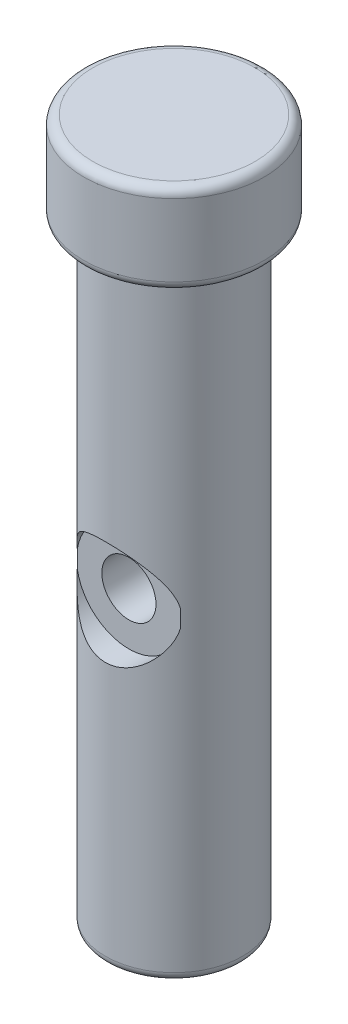
ISO-10303-21;
HEADER;
FILE_DESCRIPTION(('STEP AP214'),'2;1');
FILE_NAME('part.step','',(''),(''),'','','');
FILE_SCHEMA(('AUTOMOTIVE_DESIGN { 1 0 10303 214 1 1 1 1 }'));
ENDSEC;
DATA;
#1=APPLICATION_CONTEXT('core data for automotive mechanical design processes');
#2=APPLICATION_PROTOCOL_DEFINITION('international standard','automotive_design',2000,#1);
#3=PRODUCT_CONTEXT('',#1,'mechanical');
#4=PRODUCT('Part','Part','',(#3));
#5=PRODUCT_RELATED_PRODUCT_CATEGORY('part','',(#4));
#6=PRODUCT_DEFINITION_FORMATION('','',#4);
#7=PRODUCT_DEFINITION_CONTEXT('part definition',#1,'design');
#8=PRODUCT_DEFINITION('design','',#6,#7);
#9=PRODUCT_DEFINITION_SHAPE('','',#8);
#10=(LENGTH_UNIT() NAMED_UNIT(*) SI_UNIT(.MILLI.,.METRE.));
#11=(NAMED_UNIT(*) PLANE_ANGLE_UNIT() SI_UNIT($,.RADIAN.));
#12=(NAMED_UNIT(*) SI_UNIT($,.STERADIAN.) SOLID_ANGLE_UNIT());
#13=UNCERTAINTY_MEASURE_WITH_UNIT(LENGTH_MEASURE(1.E-05),#10,'distance_accuracy_value','');
#14=(GEOMETRIC_REPRESENTATION_CONTEXT(3) GLOBAL_UNCERTAINTY_ASSIGNED_CONTEXT((#13)) GLOBAL_UNIT_ASSIGNED_CONTEXT((#10,
#11,#12)) REPRESENTATION_CONTEXT('',''));
#15=CARTESIAN_POINT('',(0.,0.,0.));
#16=DIRECTION('',(0.,0.,1.));
#17=DIRECTION('',(1.,0.,0.));
#18=AXIS2_PLACEMENT_3D('',#15,#16,#17);
#19=CARTESIAN_POINT('',(0.,0.,0.));
#20=DIRECTION('',(0.,1.,0.));
#21=DIRECTION('',(-1.,0.,0.));
#22=AXIS2_PLACEMENT_3D('',#19,#20,#21);
#23=CYLINDRICAL_SURFACE('',#22,3.79999999999994);
#24=CARTESIAN_POINT('',(0.,-5.,0.));
#25=DIRECTION('',(0.,1.,0.));
#26=DIRECTION('',(-1.,0.,0.));
#27=AXIS2_PLACEMENT_3D('',#24,#25,#26);
#28=CIRCLE('',#27,3.79999999999988);
#29=CARTESIAN_POINT('',(-3.79999999999988,-5.,0.));
#30=VERTEX_POINT('',#29);
#31=EDGE_CURVE('E121',#30,#30,#28,.T.);
#32=ORIENTED_EDGE('',*,*,#31,.F.);
#33=EDGE_LOOP('',(#32));
#34=FACE_BOUND('',#33,.T.);
#35=CARTESIAN_POINT('',(0.,-38.5,0.));
#36=DIRECTION('',(0.,-1.,0.));
#37=DIRECTION('',(1.,0.,0.));
#38=AXIS2_PLACEMENT_3D('',#35,#36,#37);
#39=CIRCLE('',#38,3.79999999999994);
#40=CARTESIAN_POINT('',(3.79999999999994,-38.5,0.));
#41=VERTEX_POINT('',#40);
#42=EDGE_CURVE('E134',#41,#41,#39,.F.);
#43=ORIENTED_EDGE('',*,*,#42,.T.);
#44=EDGE_LOOP('',(#43));
#45=FACE_BOUND('',#44,.T.);
#46=CARTESIAN_POINT('',(1.50000000000001,-21.5,-3.49141805001915));
#47=CARTESIAN_POINT('',(1.49999138934054,-21.5804515862932,-3.49142589940348));
#48=CARTESIAN_POINT('',(1.49348902631829,-21.6610223855993,-3.49423798732025));
#49=CARTESIAN_POINT('',(1.46771910914597,-21.8198585973117,-3.50513672119896));
#50=CARTESIAN_POINT('',(1.44841842111774,-21.8981174735489,-3.51323705718366));
#51=CARTESIAN_POINT('',(1.39789821854028,-22.0497652683184,-3.53364038169468));
#52=CARTESIAN_POINT('',(1.3667228726034,-22.1231710648414,-3.54592777852199));
#53=CARTESIAN_POINT('',(1.29346693178774,-22.263692375484,-3.57329902032761));
#54=CARTESIAN_POINT('',(1.25138892977227,-22.3308093800401,-3.58838220017201));
#55=CARTESIAN_POINT('',(1.15501524548735,-22.4606243065997,-3.62058614923694));
#56=CARTESIAN_POINT('',(1.10021008970153,-22.5229281947145,-3.63777133728669));
#57=CARTESIAN_POINT('',(0.981010864129778,-22.637747473458,-3.67171013127485));
#58=CARTESIAN_POINT('',(0.916613502348842,-22.6902594895799,-3.68846358672032));
#59=CARTESIAN_POINT('',(0.777030595417696,-22.7859431300406,-3.7204213666067));
#60=CARTESIAN_POINT('',(0.701526693832917,-22.828680825116,-3.7355419612661));
#61=CARTESIAN_POINT('',(0.543697838652514,-22.9006809812271,-3.76175194224113));
#62=CARTESIAN_POINT('',(0.461375607469394,-22.9299487901852,-3.77284292805556));
#63=CARTESIAN_POINT('',(0.296376280159388,-22.9727790863564,-3.78928826916624));
#64=CARTESIAN_POINT('',(0.213900018108004,-22.9870187485434,-3.79488907863148));
#65=CARTESIAN_POINT('',(0.047551185709388,-23.0015667483585,-3.80061243706081));
#66=CARTESIAN_POINT('',(-0.0363208669212161,-23.0018801410749,-3.80073697385372));
#67=CARTESIAN_POINT('',(-0.198194350424872,-22.9889429683737,-3.79564520511569));
#68=CARTESIAN_POINT('',(-0.276265864583525,-22.9764337696606,-3.79072081116538));
#69=CARTESIAN_POINT('',(-0.429097336424106,-22.9394645061627,-3.77647568130674));
#70=CARTESIAN_POINT('',(-0.503857051218962,-22.9150035664155,-3.76715462352947));
#71=CARTESIAN_POINT('',(-0.649280023654346,-22.8545228071967,-3.74485417838105));
#72=CARTESIAN_POINT('',(-0.719865108365268,-22.8183352702658,-3.73182206387545));
#73=CARTESIAN_POINT('',(-0.854141836884575,-22.7355837064482,-3.70339831896516));
#74=CARTESIAN_POINT('',(-0.917831134297479,-22.6890161639913,-3.68800588970565));
#75=CARTESIAN_POINT('',(-1.04084398796143,-22.5833431908065,-3.65526365722049));
#76=CARTESIAN_POINT('',(-1.09962553547504,-22.523625168457,-3.63785163152035));
#77=CARTESIAN_POINT('',(-1.20655795312982,-22.3951029827792,-3.60379995652826));
#78=CARTESIAN_POINT('',(-1.25470552607257,-22.3262960118459,-3.58716054805552));
#79=CARTESIAN_POINT('',(-1.3401979249377,-22.1791876117322,-3.55612146395844));
#80=CARTESIAN_POINT('',(-1.37721749372035,-22.1006806475295,-3.5417940362025));
#81=CARTESIAN_POINT('',(-1.43729731683198,-21.9378309772364,-3.51784521745968));
#82=CARTESIAN_POINT('',(-1.46036635639556,-21.8534919811943,-3.50822086548286));
#83=CARTESIAN_POINT('',(-1.49059023775758,-21.6867694576774,-3.49548215031399));
#84=CARTESIAN_POINT('',(-1.49861511123585,-21.6045711238593,-3.49201255715577));
#85=CARTESIAN_POINT('',(-1.50105455936887,-21.4399470740869,-3.49096545123117));
#86=CARTESIAN_POINT('',(-1.49547309517293,-21.3575214312864,-3.49338622362991));
#87=CARTESIAN_POINT('',(-1.47164981281659,-21.199532556138,-3.50348331162731));
#88=CARTESIAN_POINT('',(-1.45411920701902,-21.1238408999755,-3.51086407773853));
#89=CARTESIAN_POINT('',(-1.40781189999666,-20.9765200946043,-3.52968635129391));
#90=CARTESIAN_POINT('',(-1.37903274594538,-20.9048918353521,-3.5411287443549));
#91=CARTESIAN_POINT('',(-1.30975971872506,-20.7645426439679,-3.56734484173044));
#92=CARTESIAN_POINT('',(-1.26884386090053,-20.6960520989053,-3.58223334756553));
#93=CARTESIAN_POINT('',(-1.17689395891062,-20.5666032258746,-3.61348527632925));
#94=CARTESIAN_POINT('',(-1.12585587981324,-20.5056479173919,-3.62984928600178));
#95=CARTESIAN_POINT('',(-1.01079534511714,-20.3884666780817,-3.66362298546036));
#96=CARTESIAN_POINT('',(-0.946104988314036,-20.3328915526857,-3.68102368465884));
#97=CARTESIAN_POINT('',(-0.807897988407846,-20.233289728179,-3.71380380198734));
#98=CARTESIAN_POINT('',(-0.734381064814317,-20.1892633962071,-3.72918315585053));
#99=CARTESIAN_POINT('',(-0.580420648172437,-20.1142024446752,-3.75622240946359));
#100=CARTESIAN_POINT('',(-0.499984234118845,-20.0831547335067,-3.76788605443015));
#101=CARTESIAN_POINT('',(-0.334458077708207,-20.0352300878231,-3.7861662386384));
#102=CARTESIAN_POINT('',(-0.249370812384482,-20.0183456868007,-3.79278543700488));
#103=CARTESIAN_POINT('',(-0.0828095721301419,-20.0000966344259,-3.79995356172548));
#104=CARTESIAN_POINT('',(-0.0014512130685784,-19.9978109169364,-3.80086268491117));
#105=CARTESIAN_POINT('',(0.16044780073664,-20.0064053649338,-3.79747398083981));
#106=CARTESIAN_POINT('',(0.240988572016045,-20.0172836267342,-3.79317690646808));
#107=CARTESIAN_POINT('',(0.396550793067133,-20.0512408256627,-3.7800356492471));
#108=CARTESIAN_POINT('',(0.471664821769232,-20.0739528435886,-3.77132842325217));
#109=CARTESIAN_POINT('',(0.617006895855154,-20.1305518706833,-3.75029333630242));
#110=CARTESIAN_POINT('',(0.687234025940451,-20.1644409664929,-3.73796479933465));
#111=CARTESIAN_POINT('',(0.824187345573376,-20.2441082688209,-3.71023059695301));
#112=CARTESIAN_POINT('',(0.890625423421006,-20.2903422448221,-3.69471379577514));
#113=CARTESIAN_POINT('',(1.01507565161335,-20.3926978038429,-3.66248019503792));
#114=CARTESIAN_POINT('',(1.07308442918586,-20.4488233249477,-3.64576291911447));
#115=CARTESIAN_POINT('',(1.18262244756297,-20.5733471362867,-3.61177095393521));
#116=CARTESIAN_POINT('',(1.23355492741273,-20.6422793932119,-3.59452291126947));
#117=CARTESIAN_POINT('',(1.32316617146225,-20.788269358491,-3.5625139915532));
#118=CARTESIAN_POINT('',(1.36184336055236,-20.8653281096064,-3.54775343432045));
#119=CARTESIAN_POINT('',(1.42278067872679,-21.0184614713342,-3.52372998290796));
#120=CARTESIAN_POINT('',(1.44618886036685,-21.0940221788202,-3.51409673515669));
#121=CARTESIAN_POINT('',(1.480810425567,-21.248197200195,-3.49965226945409));
#122=CARTESIAN_POINT('',(1.49205808070512,-21.3268022822911,-3.49482750295225));
#123=CARTESIAN_POINT('',(1.49901480820947,-21.4371319732704,-3.49184026262714));
#124=CARTESIAN_POINT('',(1.50000336532811,-21.468556881725,-3.49141498222234));
#125=CARTESIAN_POINT('',(1.50000000000001,-21.5,-3.49141805001915));
#126=B_SPLINE_CURVE_WITH_KNOTS('',3,(#46,#47,#48,#49,#50,#51,#52,#53,#54,#55,#56,#57,#58,#59,
#60,#61,#62,#63,#64,#65,#66,#67,#68,#69,#70,#71,#72,#73,#74,#75,#76,#77,#78,#79,#80,#81,#82,#83,
#84,#85,#86,#87,#88,#89,#90,#91,#92,#93,#94,#95,#96,#97,#98,#99,#100,#101,#102,#103,#104,#105,
#106,#107,#108,#109,#110,#111,#112,#113,#114,#115,#116,#117,#118,#119,#120,#121,#122,#123,#124,
#125),.UNSPECIFIED.,.T.,.F.,(4,2,2,2,2,2,2,2,2,2,2,2,2,2,2,2,2,2,2,2,2,2,2,2,2,2,2,2,2,2,2,2,2,
2,2,2,2,2,2,4),(0.,0.241258974630674,0.483145001586304,0.724139966359462,0.965077670371689,
1.21817638181349,1.47136215640359,1.73422908181348,1.99699155145784,2.24732954374186,
2.49757666524261,2.73412868652043,2.97069802787758,3.21081236859373,3.45100815675304,
3.70660964628551,3.96229027738027,4.22484534170299,4.48723489141705,4.73391642140907,
4.98052614474034,5.21360932498362,5.44674335906409,5.68918894929397,5.93173137842906,
6.19163427514351,6.45154543323366,6.71119378110702,6.97070516334217,7.21366684415071,
7.45659339366689,7.69240029292648,7.92825123975333,8.17443353232482,8.42071405889346,
8.6817559687856,8.94283141545955,9.18085422845703,9.41820446746391,9.51249638666303),.UNSPECIFIED.);
#127=CARTESIAN_POINT('',(1.50000000000001,-21.5,-3.49141805001915));
#128=VERTEX_POINT('',#127);
#129=EDGE_CURVE('E79',#128,#128,#126,.T.);
#130=ORIENTED_EDGE('',*,*,#129,.F.);
#131=EDGE_LOOP('',(#130));
#132=FACE_BOUND('',#131,.T.);
#133=CARTESIAN_POINT('',(-2.86181760425075,-21.0309584240172,2.5));
#134=CARTESIAN_POINT('',(-2.84893316136144,-20.9523315745411,2.5147328893786));
#135=CARTESIAN_POINT('',(-2.83293273067656,-20.8750109142028,2.53283623165705));
#136=CARTESIAN_POINT('',(-2.79519603397979,-20.7235017694629,2.57442981603163));
#137=CARTESIAN_POINT('',(-2.77347609841736,-20.6493050541843,2.59790469658195));
#138=CARTESIAN_POINT('',(-2.70070178135878,-20.4325987148322,2.67414648655351));
#139=CARTESIAN_POINT('',(-2.64182834864109,-20.2948008444783,2.73298741480104));
#140=CARTESIAN_POINT('',(-2.5326804841542,-20.0845430349777,2.83349597735357));
#141=CARTESIAN_POINT('',(-2.48817230282309,-20.0077482944858,2.8727840852843));
#142=CARTESIAN_POINT('',(-2.39269721960788,-19.8590245024207,2.9527727730231));
#143=CARTESIAN_POINT('',(-2.34173055471508,-19.7870952724582,2.99347330096325));
#144=CARTESIAN_POINT('',(-2.23332439509404,-19.6479541879983,3.0752063183247));
#145=CARTESIAN_POINT('',(-2.17585998946224,-19.580762210011,3.11623948418053));
#146=CARTESIAN_POINT('',(-2.05470412117828,-19.4515776097882,3.19742247288386));
#147=CARTESIAN_POINT('',(-1.99100961597782,-19.3895875557109,3.23757185227975));
#148=CARTESIAN_POINT('',(-1.85720381511498,-19.2709132151831,3.31614873428642));
#149=CARTESIAN_POINT('',(-1.78706321196797,-19.2142557986612,3.35456705613411));
#150=CARTESIAN_POINT('',(-1.64080130126751,-19.107096439447,3.42848129096359));
#151=CARTESIAN_POINT('',(-1.56468126291492,-19.0565931962389,3.46397782086961));
#152=CARTESIAN_POINT('',(-1.40697530125724,-18.9625175862896,3.53096730997154));
#153=CARTESIAN_POINT('',(-1.32540835813396,-18.9189227718707,3.56247316624312));
#154=CARTESIAN_POINT('',(-1.15711028495587,-18.8392167585822,3.62063905481176));
#155=CARTESIAN_POINT('',(-1.07038185268466,-18.8031016936949,3.64730158956986));
#156=CARTESIAN_POINT('',(-0.858094350733373,-18.7267719847398,3.70403902656855));
#157=CARTESIAN_POINT('',(-0.730425515973985,-18.6903191757557,3.73148500913895));
#158=CARTESIAN_POINT('',(-0.469271318417231,-18.635112336735,3.77322867753894));
#159=CARTESIAN_POINT('',(-0.335789179148066,-18.6163486254402,3.78753355539664));
#160=CARTESIAN_POINT('',(-0.0663877572205715,-18.5976118170159,3.8018177839588));
#161=CARTESIAN_POINT('',(0.0695366932475875,-18.5976848487137,3.80176196711917));
#162=CARTESIAN_POINT('',(0.339270817849987,-18.6167402945188,3.78723509602968));
#163=CARTESIAN_POINT('',(0.473080059289159,-18.6357265280045,3.7727611301434));
#164=CARTESIAN_POINT('',(0.730277262620368,-18.6904784205595,3.73136771014024));
#165=CARTESIAN_POINT('',(0.853864736752582,-18.7256533604649,3.70488684927299));
#166=CARTESIAN_POINT('',(1.09292067771972,-18.8108288575596,3.64154266121664));
#167=CARTESIAN_POINT('',(1.20838855667189,-18.8608304868807,3.6046785832171));
#168=CARTESIAN_POINT('',(1.44175896298977,-18.9800120463634,3.51830435711049));
#169=CARTESIAN_POINT('',(1.55853862932337,-19.0506942521851,3.46785048291016));
#170=CARTESIAN_POINT('',(1.77912502941117,-19.205889108974,3.36003362626411));
#171=CARTESIAN_POINT('',(1.88291205832706,-19.2904223288754,3.30266040245973));
#172=CARTESIAN_POINT('',(2.09650694948315,-19.4899857382112,3.17227187753434));
#173=CARTESIAN_POINT('',(2.20328173850093,-19.6077255492278,3.09844095249226));
#174=CARTESIAN_POINT('',(2.39635643229164,-19.8590990029055,2.95162755486438));
#175=CARTESIAN_POINT('',(2.48269481621259,-19.9927020529218,2.87864373781489));
#176=CARTESIAN_POINT('',(2.59420829782226,-20.2015703260908,2.77713587511742));
#177=CARTESIAN_POINT('',(2.62776998151283,-20.2708417217419,2.74530697930492));
#178=CARTESIAN_POINT('',(2.68965863669173,-20.4129214836237,2.68469789270843));
#179=CARTESIAN_POINT('',(2.71798991332764,-20.4857268781121,2.6559152029958));
#180=CARTESIAN_POINT('',(2.76922966593972,-20.6353315457944,2.60245160098127));
#181=CARTESIAN_POINT('',(2.79210050422365,-20.7121543269756,2.5777994882704));
#182=CARTESIAN_POINT('',(2.83172067113947,-20.8691718178096,2.53420944494608));
#183=CARTESIAN_POINT('',(2.84845182598388,-20.949375767039,2.51528850731465));
#184=CARTESIAN_POINT('',(2.86181760425076,-21.0309584240171,2.5));
#185=B_SPLINE_CURVE_WITH_KNOTS('',3,(#133,#134,#135,#136,#137,#138,#139,#140,#141,#142,#143,
#144,#145,#146,#147,#148,#149,#150,#151,#152,#153,#154,#155,#156,#157,#158,#159,#160,#161,#162,
#163,#164,#165,#166,#167,#168,#169,#170,#171,#172,#173,#174,#175,#176,#177,#178,#179,#180,#181,
#182,#183,#184),.UNSPECIFIED.,.F.,.F.,(4,2,2,2,2,2,2,2,2,2,2,2,2,2,2,2,2,2,2,2,2,2,2,2,2,4),(0.,
0.242689300283201,0.484693044064003,0.965109202787394,1.25605108357691,1.54698229146815,
1.83906931370026,2.13129969939042,2.42493150292758,2.71850114743384,3.01109641514076,
3.30354007120431,3.70841426675028,4.11306674544226,4.51871017682172,4.92443554144155,
5.31640507651757,5.70840296219145,6.14340971068275,6.57906840395907,7.10290411862057,
7.62574552879219,7.87539667763357,8.1248414134477,8.37595885349175,8.62781373034285),.UNSPECIFIED.);
#186=CARTESIAN_POINT('',(-2.86181760425075,-21.0309584240172,2.5));
#187=VERTEX_POINT('',#186);
#188=CARTESIAN_POINT('',(2.86181760425076,-21.0309584240171,2.5));
#189=VERTEX_POINT('',#188);
#190=EDGE_CURVE('E54',#187,#189,#185,.T.);
#191=ORIENTED_EDGE('',*,*,#190,.T.);
#192=DIRECTION('',(0.,1.,0.));
#193=VECTOR('',#192,1.);
#194=CARTESIAN_POINT('',(2.86181760425075,0.,2.5));
#195=LINE('',#194,#193);
#196=CARTESIAN_POINT('',(2.86181760425076,-21.9690415759828,2.5));
#197=VERTEX_POINT('',#196);
#198=EDGE_CURVE('E72',#189,#197,#195,.F.);
#199=ORIENTED_EDGE('',*,*,#198,.T.);
#200=CARTESIAN_POINT('',(2.86181760425076,-21.9690415759828,2.5));
#201=CARTESIAN_POINT('',(2.84893316136144,-22.0476684254589,2.5147328893786));
#202=CARTESIAN_POINT('',(2.83293273067656,-22.1249890857972,2.53283623165706));
#203=CARTESIAN_POINT('',(2.79519603397979,-22.2764982305371,2.57442981603164));
#204=CARTESIAN_POINT('',(2.77347609841736,-22.3506949458157,2.59790469658196));
#205=CARTESIAN_POINT('',(2.70070178135876,-22.5674012851678,2.67414648655353));
#206=CARTESIAN_POINT('',(2.64182834864107,-22.7051991555217,2.73298741480107));
#207=CARTESIAN_POINT('',(2.53268048415417,-22.9154569650224,2.8334959773536));
#208=CARTESIAN_POINT('',(2.48817230282306,-22.9922517055142,2.87278408528433));
#209=CARTESIAN_POINT('',(2.39269721960785,-23.1409754975793,2.95277277302314));
#210=CARTESIAN_POINT('',(2.34173055471504,-23.2129047275419,2.99347330096328));
#211=CARTESIAN_POINT('',(2.23332439509399,-23.3520458120017,3.07520631832473));
#212=CARTESIAN_POINT('',(2.1758599894622,-23.419237789989,3.11623948418057));
#213=CARTESIAN_POINT('',(2.05470412117823,-23.5484223902118,3.1974224728839));
#214=CARTESIAN_POINT('',(1.99100961597777,-23.6104124442891,3.23757185227979));
#215=CARTESIAN_POINT('',(1.85720381511492,-23.7290867848169,3.31614873428646));
#216=CARTESIAN_POINT('',(1.7870632119679,-23.7857442013388,3.35456705613415));
#217=CARTESIAN_POINT('',(1.64080130126744,-23.892903560553,3.42848129096362));
#218=CARTESIAN_POINT('',(1.56468126291485,-23.943406803761,3.46397782086964));
#219=CARTESIAN_POINT('',(1.40697530125717,-24.0374824137104,3.53096730997157));
#220=CARTESIAN_POINT('',(1.32540835813388,-24.0810772281293,3.56247316624315));
#221=CARTESIAN_POINT('',(1.15711028495579,-24.1607832414178,3.62063905481179));
#222=CARTESIAN_POINT('',(1.07038185268458,-24.1968983063051,3.64730158956989));
#223=CARTESIAN_POINT('',(0.858094350733283,-24.2732280152602,3.70403902656857));
#224=CARTESIAN_POINT('',(0.730425515973894,-24.3096808242442,3.73148500913896));
#225=CARTESIAN_POINT('',(0.469271318417141,-24.3648876632649,3.77322867753895));
#226=CARTESIAN_POINT('',(0.335789179147976,-24.3836513745597,3.78753355539665));
#227=CARTESIAN_POINT('',(0.0663877572204835,-24.402388182984,3.8018177839588));
#228=CARTESIAN_POINT('',(-0.0695366932476735,-24.4023151512862,3.80176196711917));
#229=CARTESIAN_POINT('',(-0.339270817850069,-24.3832597054811,3.78723509602967));
#230=CARTESIAN_POINT('',(-0.473080059289238,-24.3642734719954,3.77276113014339));
#231=CARTESIAN_POINT('',(-0.730277262620444,-24.3095215794404,3.73136771014023));
#232=CARTESIAN_POINT('',(-0.853864736752657,-24.274346639535,3.70488684927297));
#233=CARTESIAN_POINT('',(-1.0929206777198,-24.1891711424402,3.64154266121662));
#234=CARTESIAN_POINT('',(-1.20838855667196,-24.1391695131192,3.60467858321707));
#235=CARTESIAN_POINT('',(-1.44175896298984,-24.0199879536365,3.51830435711046));
#236=CARTESIAN_POINT('',(-1.55853862932343,-23.9493057478148,3.46785048291013));
#237=CARTESIAN_POINT('',(-1.77912502941123,-23.7941108910258,3.36003362626407));
#238=CARTESIAN_POINT('',(-1.88291205832713,-23.7095776711245,3.30266040245969));
#239=CARTESIAN_POINT('',(-2.09650694948321,-23.5100142617886,3.1722718775343));
#240=CARTESIAN_POINT('',(-2.20328173850098,-23.392274450772,3.09844095249222));
#241=CARTESIAN_POINT('',(-2.3963564322917,-23.1409009970943,2.95162755486434));
#242=CARTESIAN_POINT('',(-2.48269481621264,-23.007297947078,2.87864373781485));
#243=CARTESIAN_POINT('',(-2.59420829782229,-22.798429673909,2.77713587511738));
#244=CARTESIAN_POINT('',(-2.62776998151286,-22.7291582782579,2.74530697930489));
#245=CARTESIAN_POINT('',(-2.68965863669175,-22.5870785163761,2.6846978927084));
#246=CARTESIAN_POINT('',(-2.71798991332766,-22.5142731218878,2.65591520299577));
#247=CARTESIAN_POINT('',(-2.76922966593973,-22.3646684542054,2.60245160098125));
#248=CARTESIAN_POINT('',(-2.79210050422366,-22.2878456730242,2.57779948827039));
#249=CARTESIAN_POINT('',(-2.83172067113948,-22.1308281821903,2.53420944494608));
#250=CARTESIAN_POINT('',(-2.84845182598387,-22.0506242329609,2.51528850731464));
#251=CARTESIAN_POINT('',(-2.86181760425075,-21.9690415759828,2.5));
#252=B_SPLINE_CURVE_WITH_KNOTS('',3,(#200,#201,#202,#203,#204,#205,#206,#207,#208,#209,#210,
#211,#212,#213,#214,#215,#216,#217,#218,#219,#220,#221,#222,#223,#224,#225,#226,#227,#228,#229,
#230,#231,#232,#233,#234,#235,#236,#237,#238,#239,#240,#241,#242,#243,#244,#245,#246,#247,#248,
#249,#250,#251),.UNSPECIFIED.,.F.,.F.,(4,2,2,2,2,2,2,2,2,2,2,2,2,2,2,2,2,2,2,2,2,2,2,2,2,4),(0.,
0.242689300283208,0.484693044064012,0.965109202787421,1.25605108357694,1.54698229146819,
1.8390693137003,2.13129969939046,2.42493150292762,2.71850114743388,3.01109641514081,
3.30354007120436,3.70841426675033,4.1130667454423,4.51871017682175,4.92443554144158,
5.3164050765176,5.70840296219148,6.14340971068278,6.57906840395911,7.10290411862063,
7.62574552879226,7.87539667763362,8.12484141344773,8.37595885349176,8.62781373034285),.UNSPECIFIED.);
#253=CARTESIAN_POINT('',(-2.86181760425075,-21.9690415759828,2.5));
#254=VERTEX_POINT('',#253);
#255=EDGE_CURVE('E11',#197,#254,#252,.T.);
#256=ORIENTED_EDGE('',*,*,#255,.T.);
#257=DIRECTION('',(0.,1.,0.));
#258=VECTOR('',#257,1.);
#259=CARTESIAN_POINT('',(-2.86181760425075,0.,2.5));
#260=LINE('',#259,#258);
#261=EDGE_CURVE('E80',#254,#187,#260,.T.);
#262=ORIENTED_EDGE('',*,*,#261,.T.);
#263=EDGE_LOOP('',(#191,#199,#256,#262));
#264=FACE_BOUND('',#263,.T.);
#265=ADVANCED_FACE('F39',(#34,#45,#132,#264),#23,.T.);
#266=CARTESIAN_POINT('',(0.,-21.5,-5.));
#267=DIRECTION('',(0.,0.,1.));
#268=DIRECTION('',(1.,0.,0.));
#269=AXIS2_PLACEMENT_3D('',#266,#267,#268);
#270=CYLINDRICAL_SURFACE('',#269,1.5);
#271=ORIENTED_EDGE('',*,*,#129,.T.);
#272=EDGE_LOOP('',(#271));
#273=FACE_BOUND('',#272,.T.);
#274=CARTESIAN_POINT('',(0.,-21.5,2.5));
#275=DIRECTION('',(0.,0.,1.));
#276=DIRECTION('',(1.,0.,0.));
#277=AXIS2_PLACEMENT_3D('',#274,#275,#276);
#278=CIRCLE('',#277,1.5);
#279=CARTESIAN_POINT('',(1.50000000000001,-21.5,2.5));
#280=VERTEX_POINT('',#279);
#281=EDGE_CURVE('E86',#280,#280,#278,.F.);
#282=ORIENTED_EDGE('',*,*,#281,.F.);
#283=EDGE_LOOP('',(#282));
#284=FACE_BOUND('',#283,.T.);
#285=ADVANCED_FACE('F108',(#273,#284),#270,.F.);
#286=CARTESIAN_POINT('',(-5.,0.,0.));
#287=DIRECTION('',(0.,1.,0.));
#288=DIRECTION('',(-1.,0.,0.));
#289=AXIS2_PLACEMENT_3D('',#286,#287,#288);
#290=PLANE('',#289);
#291=CARTESIAN_POINT('',(0.,0.,0.));
#292=DIRECTION('',(0.,1.,0.));
#293=DIRECTION('',(-1.,0.,0.));
#294=AXIS2_PLACEMENT_3D('',#291,#292,#293);
#295=CIRCLE('',#294,4.5);
#296=CARTESIAN_POINT('',(-4.5,0.,0.));
#297=VERTEX_POINT('',#296);
#298=EDGE_CURVE('E130',#297,#297,#295,.T.);
#299=ORIENTED_EDGE('',*,*,#298,.T.);
#300=EDGE_LOOP('',(#299));
#301=FACE_BOUND('',#300,.T.);
#302=ADVANCED_FACE('F113',(#301),#290,.T.);
#303=CARTESIAN_POINT('',(0.,-38.,0.));
#304=DIRECTION('',(0.,-1.,0.));
#305=DIRECTION('',(1.,0.,0.));
#306=AXIS2_PLACEMENT_3D('',#303,#304,#305);
#307=PLANE('',#306);
#308=CARTESIAN_POINT('',(0.,-38.,0.));
#309=DIRECTION('',(0.,1.,0.));
#310=DIRECTION('',(-1.,0.,0.));
#311=AXIS2_PLACEMENT_3D('',#308,#309,#310);
#312=CIRCLE('',#311,1.8);
#313=CARTESIAN_POINT('',(-1.8,-38.,0.));
#314=VERTEX_POINT('',#313);
#315=EDGE_CURVE('E150',#314,#314,#312,.T.);
#316=ORIENTED_EDGE('',*,*,#315,.F.);
#317=EDGE_LOOP('',(#316));
#318=FACE_BOUND('',#317,.T.);
#319=ADVANCED_FACE('F193',(#318),#307,.T.);
#320=CARTESIAN_POINT('',(0.,0.,0.));
#321=DIRECTION('',(0.,1.,0.));
#322=DIRECTION('',(-1.,0.,0.));
#323=AXIS2_PLACEMENT_3D('',#320,#321,#322);
#324=CYLINDRICAL_SURFACE('',#323,1.8);
#325=CARTESIAN_POINT('',(0.,-38.5,0.));
#326=DIRECTION('',(0.,-1.,0.));
#327=DIRECTION('',(1.,0.,0.));
#328=AXIS2_PLACEMENT_3D('',#325,#326,#327);
#329=CIRCLE('',#328,1.8);
#330=CARTESIAN_POINT('',(1.80000000000001,-38.5,0.));
#331=VERTEX_POINT('',#330);
#332=EDGE_CURVE('E138',#331,#331,#329,.T.);
#333=ORIENTED_EDGE('',*,*,#332,.T.);
#334=EDGE_LOOP('',(#333));
#335=FACE_BOUND('',#334,.T.);
#336=ORIENTED_EDGE('',*,*,#315,.T.);
#337=EDGE_LOOP('',(#336));
#338=FACE_BOUND('',#337,.T.);
#339=ADVANCED_FACE('F197',(#335,#338),#324,.F.);
#340=CARTESIAN_POINT('',(-1.8,-39.,0.));
#341=DIRECTION('',(0.,-1.,0.));
#342=DIRECTION('',(1.,0.,0.));
#343=AXIS2_PLACEMENT_3D('',#340,#341,#342);
#344=PLANE('',#343);
#345=CARTESIAN_POINT('',(0.,-39.,0.));
#346=DIRECTION('',(0.,-1.,0.));
#347=DIRECTION('',(1.,0.,0.));
#348=AXIS2_PLACEMENT_3D('',#345,#346,#347);
#349=CIRCLE('',#348,2.3);
#350=CARTESIAN_POINT('',(2.30000000000001,-39.,0.));
#351=VERTEX_POINT('',#350);
#352=EDGE_CURVE('E142',#351,#351,#349,.F.);
#353=ORIENTED_EDGE('',*,*,#352,.T.);
#354=EDGE_LOOP('',(#353));
#355=FACE_BOUND('',#354,.T.);
#356=CARTESIAN_POINT('',(0.,-39.,0.));
#357=DIRECTION('',(0.,-1.,0.));
#358=DIRECTION('',(1.,0.,0.));
#359=AXIS2_PLACEMENT_3D('',#356,#357,#358);
#360=CIRCLE('',#359,3.29999999999994);
#361=CARTESIAN_POINT('',(3.29999999999994,-39.,0.));
#362=VERTEX_POINT('',#361);
#363=EDGE_CURVE('E146',#362,#362,#360,.T.);
#364=ORIENTED_EDGE('',*,*,#363,.T.);
#365=EDGE_LOOP('',(#364));
#366=FACE_BOUND('',#365,.T.);
#367=ADVANCED_FACE('F200',(#355,#366),#344,.T.);
#368=CARTESIAN_POINT('',(-3.79999999999988,-5.,0.));
#369=DIRECTION('',(0.,-1.,0.));
#370=DIRECTION('',(1.,0.,0.));
#371=AXIS2_PLACEMENT_3D('',#368,#369,#370);
#372=PLANE('',#371);
#373=CARTESIAN_POINT('',(0.,-5.,0.));
#374=DIRECTION('',(0.,-1.,0.));
#375=DIRECTION('',(1.,0.,0.));
#376=AXIS2_PLACEMENT_3D('',#373,#374,#375);
#377=CIRCLE('',#376,4.5);
#378=CARTESIAN_POINT('',(4.5,-5.,0.));
#379=VERTEX_POINT('',#378);
#380=EDGE_CURVE('E89',#379,#379,#377,.T.);
#381=ORIENTED_EDGE('',*,*,#380,.T.);
#382=EDGE_LOOP('',(#381));
#383=FACE_BOUND('',#382,.T.);
#384=ORIENTED_EDGE('',*,*,#31,.T.);
#385=EDGE_LOOP('',(#384));
#386=FACE_BOUND('',#385,.T.);
#387=ADVANCED_FACE('F203',(#383,#386),#372,.T.);
#388=CARTESIAN_POINT('',(0.,0.,0.));
#389=DIRECTION('',(0.,1.,0.));
#390=DIRECTION('',(-1.,0.,0.));
#391=AXIS2_PLACEMENT_3D('',#388,#389,#390);
#392=CYLINDRICAL_SURFACE('',#391,5.);
#393=CARTESIAN_POINT('',(0.,-0.5,0.));
#394=DIRECTION('',(0.,1.,0.));
#395=DIRECTION('',(-1.,0.,0.));
#396=AXIS2_PLACEMENT_3D('',#393,#394,#395);
#397=CIRCLE('',#396,5.);
#398=CARTESIAN_POINT('',(-5.,-0.5,0.));
#399=VERTEX_POINT('',#398);
#400=EDGE_CURVE('E92',#399,#399,#397,.F.);
#401=ORIENTED_EDGE('',*,*,#400,.T.);
#402=EDGE_LOOP('',(#401));
#403=FACE_BOUND('',#402,.T.);
#404=CARTESIAN_POINT('',(0.,-4.5,0.));
#405=DIRECTION('',(0.,-1.,0.));
#406=DIRECTION('',(1.,0.,0.));
#407=AXIS2_PLACEMENT_3D('',#404,#405,#406);
#408=CIRCLE('',#407,5.);
#409=CARTESIAN_POINT('',(5.,-4.5,0.));
#410=VERTEX_POINT('',#409);
#411=EDGE_CURVE('E126',#410,#410,#408,.F.);
#412=ORIENTED_EDGE('',*,*,#411,.T.);
#413=EDGE_LOOP('',(#412));
#414=FACE_BOUND('',#413,.T.);
#415=ADVANCED_FACE('F115',(#403,#414),#392,.T.);
#416=CARTESIAN_POINT('',(0.,-38.5,0.));
#417=DIRECTION('',(0.,-1.,0.));
#418=DIRECTION('',(1.,0.,0.));
#419=AXIS2_PLACEMENT_3D('',#416,#417,#418);
#420=TOROIDAL_SURFACE('',#419,2.3,0.5);
#421=ORIENTED_EDGE('',*,*,#332,.F.);
#422=EDGE_LOOP('',(#421));
#423=FACE_BOUND('',#422,.T.);
#424=ORIENTED_EDGE('',*,*,#352,.F.);
#425=EDGE_LOOP('',(#424));
#426=FACE_BOUND('',#425,.T.);
#427=ADVANCED_FACE('F179',(#423,#426),#420,.T.);
#428=CARTESIAN_POINT('',(0.,-38.5,0.));
#429=DIRECTION('',(0.,-1.,0.));
#430=DIRECTION('',(1.,0.,0.));
#431=AXIS2_PLACEMENT_3D('',#428,#429,#430);
#432=TOROIDAL_SURFACE('',#431,3.29999999999994,0.5);
#433=ORIENTED_EDGE('',*,*,#363,.F.);
#434=EDGE_LOOP('',(#433));
#435=FACE_BOUND('',#434,.T.);
#436=ORIENTED_EDGE('',*,*,#42,.F.);
#437=EDGE_LOOP('',(#436));
#438=FACE_BOUND('',#437,.T.);
#439=ADVANCED_FACE('F176',(#435,#438),#432,.T.);
#440=CARTESIAN_POINT('',(0.,-0.5,0.));
#441=DIRECTION('',(0.,1.,0.));
#442=DIRECTION('',(-1.,0.,0.));
#443=AXIS2_PLACEMENT_3D('',#440,#441,#442);
#444=TOROIDAL_SURFACE('',#443,4.5,0.5);
#445=ORIENTED_EDGE('',*,*,#400,.F.);
#446=EDGE_LOOP('',(#445));
#447=FACE_BOUND('',#446,.T.);
#448=ORIENTED_EDGE('',*,*,#298,.F.);
#449=EDGE_LOOP('',(#448));
#450=FACE_BOUND('',#449,.T.);
#451=ADVANCED_FACE('F178',(#447,#450),#444,.T.);
#452=CARTESIAN_POINT('',(0.,-4.5,0.));
#453=DIRECTION('',(0.,-1.,0.));
#454=DIRECTION('',(1.,0.,0.));
#455=AXIS2_PLACEMENT_3D('',#452,#453,#454);
#456=TOROIDAL_SURFACE('',#455,4.5,0.5);
#457=ORIENTED_EDGE('',*,*,#380,.F.);
#458=EDGE_LOOP('',(#457));
#459=FACE_BOUND('',#458,.T.);
#460=ORIENTED_EDGE('',*,*,#411,.F.);
#461=EDGE_LOOP('',(#460));
#462=FACE_BOUND('',#461,.T.);
#463=ADVANCED_FACE('F41',(#459,#462),#456,.T.);
#464=CARTESIAN_POINT('',(0.,-21.5,5.));
#465=DIRECTION('',(0.,0.,-1.));
#466=DIRECTION('',(-1.,0.,0.));
#467=AXIS2_PLACEMENT_3D('',#464,#465,#466);
#468=CYLINDRICAL_SURFACE('',#467,2.9);
#469=CARTESIAN_POINT('',(0.,-21.5,2.5));
#470=DIRECTION('',(0.,0.,1.));
#471=DIRECTION('',(1.,0.,0.));
#472=AXIS2_PLACEMENT_3D('',#469,#470,#471);
#473=CIRCLE('',#472,2.9);
#474=EDGE_CURVE('E75',#254,#197,#473,.T.);
#475=ORIENTED_EDGE('',*,*,#474,.F.);
#476=ORIENTED_EDGE('',*,*,#255,.F.);
#477=EDGE_LOOP('',(#475,#476));
#478=FACE_BOUND('',#477,.T.);
#479=ADVANCED_FACE('F107',(#478),#468,.F.);
#480=CARTESIAN_POINT('',(0.,-21.5,2.5));
#481=DIRECTION('',(0.,0.,1.));
#482=DIRECTION('',(1.,0.,0.));
#483=AXIS2_PLACEMENT_3D('',#480,#481,#482);
#484=PLANE('',#483);
#485=EDGE_CURVE('E61',#189,#187,#473,.T.);
#486=ORIENTED_EDGE('',*,*,#485,.T.);
#487=ORIENTED_EDGE('',*,*,#261,.F.);
#488=ORIENTED_EDGE('',*,*,#474,.T.);
#489=ORIENTED_EDGE('',*,*,#198,.F.);
#490=EDGE_LOOP('',(#486,#487,#488,#489));
#491=FACE_BOUND('',#490,.T.);
#492=ORIENTED_EDGE('',*,*,#281,.T.);
#493=EDGE_LOOP('',(#492));
#494=FACE_BOUND('',#493,.T.);
#495=ADVANCED_FACE('F73',(#491,#494),#484,.T.);
#496=ORIENTED_EDGE('',*,*,#485,.F.);
#497=ORIENTED_EDGE('',*,*,#190,.F.);
#498=EDGE_LOOP('',(#496,#497));
#499=FACE_BOUND('',#498,.T.);
#500=ADVANCED_FACE('F83',(#499),#468,.F.);
#501=CLOSED_SHELL('',(#265,#285,#302,#319,#339,#367,#387,#415,#427,#439,#451,#463,#479,#495,#500));
#502=MANIFOLD_SOLID_BREP('B2',#501);
#503=ADVANCED_BREP_SHAPE_REPRESENTATION('',(#18,#502),#14);
#504=SHAPE_DEFINITION_REPRESENTATION(#9,#503);
ENDSEC;
END-ISO-10303-21;
